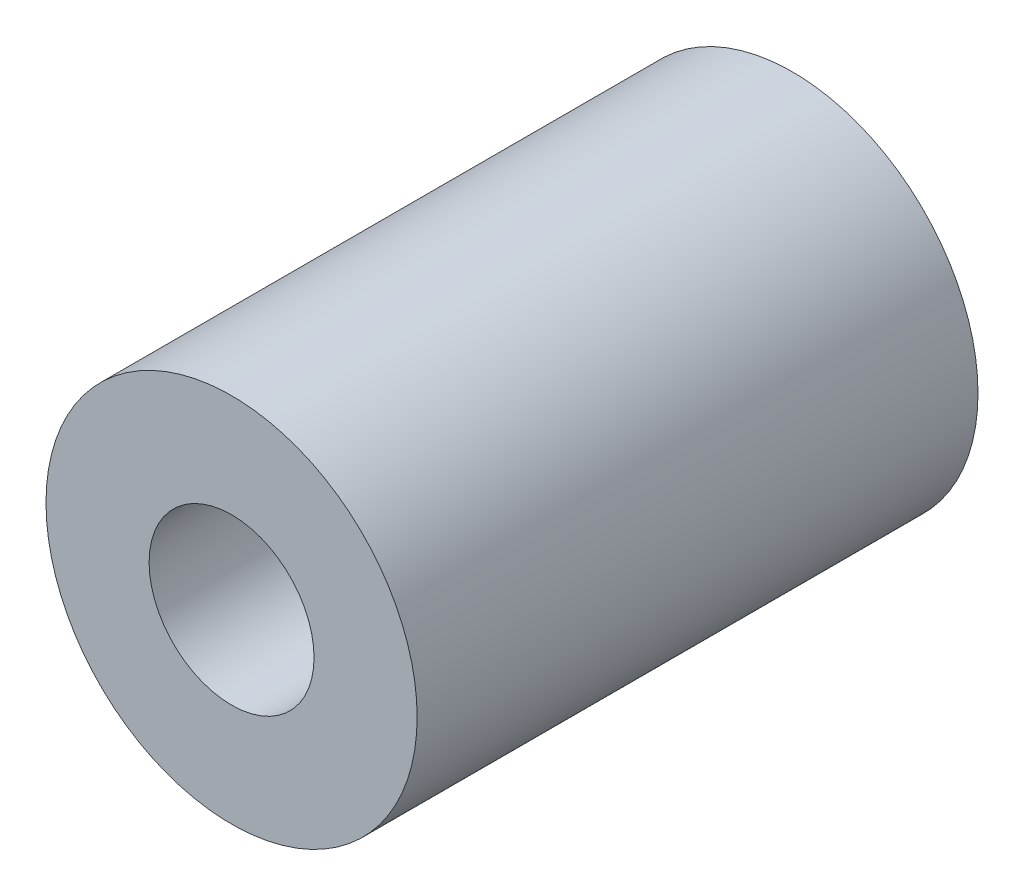
ISO-10303-21;
HEADER;
FILE_DESCRIPTION(('STEP AP214'),'2;1');
FILE_NAME('part.step','',(''),(''),'','','');
FILE_SCHEMA(('AUTOMOTIVE_DESIGN { 1 0 10303 214 1 1 1 1 }'));
ENDSEC;
DATA;
#1=APPLICATION_CONTEXT('core data for automotive mechanical design processes');
#2=APPLICATION_PROTOCOL_DEFINITION('international standard','automotive_design',2000,#1);
#3=PRODUCT_CONTEXT('',#1,'mechanical');
#4=PRODUCT('Part','Part','',(#3));
#5=PRODUCT_RELATED_PRODUCT_CATEGORY('part','',(#4));
#6=PRODUCT_DEFINITION_FORMATION('','',#4);
#7=PRODUCT_DEFINITION_CONTEXT('part definition',#1,'design');
#8=PRODUCT_DEFINITION('design','',#6,#7);
#9=PRODUCT_DEFINITION_SHAPE('','',#8);
#10=(LENGTH_UNIT() NAMED_UNIT(*) SI_UNIT(.MILLI.,.METRE.));
#11=(NAMED_UNIT(*) PLANE_ANGLE_UNIT() SI_UNIT($,.RADIAN.));
#12=(NAMED_UNIT(*) SI_UNIT($,.STERADIAN.) SOLID_ANGLE_UNIT());
#13=UNCERTAINTY_MEASURE_WITH_UNIT(LENGTH_MEASURE(1.E-05),#10,'distance_accuracy_value','');
#14=(GEOMETRIC_REPRESENTATION_CONTEXT(3) GLOBAL_UNCERTAINTY_ASSIGNED_CONTEXT((#13)) GLOBAL_UNIT_ASSIGNED_CONTEXT((#10,
#11,#12)) REPRESENTATION_CONTEXT('',''));
#15=CARTESIAN_POINT('',(0.,0.,0.));
#16=DIRECTION('',(0.,0.,1.));
#17=DIRECTION('',(1.,0.,0.));
#18=AXIS2_PLACEMENT_3D('',#15,#16,#17);
#19=CARTESIAN_POINT('',(0.,0.,6.8));
#20=DIRECTION('',(0.,0.,1.));
#21=DIRECTION('',(1.,0.,0.));
#22=AXIS2_PLACEMENT_3D('',#19,#20,#21);
#23=PLANE('',#22);
#24=CARTESIAN_POINT('',(0.,0.,6.8));
#25=DIRECTION('',(0.,0.,1.));
#26=DIRECTION('',(1.,0.,0.));
#27=AXIS2_PLACEMENT_3D('',#24,#25,#26);
#28=CIRCLE('',#27,2.25);
#29=CARTESIAN_POINT('',(2.25,0.,6.8));
#30=VERTEX_POINT('',#29);
#31=EDGE_CURVE('E10',#30,#30,#28,.T.);
#32=ORIENTED_EDGE('',*,*,#31,.T.);
#33=EDGE_LOOP('',(#32));
#34=FACE_BOUND('',#33,.T.);
#35=CARTESIAN_POINT('',(0.,0.,6.8));
#36=DIRECTION('',(0.,0.,1.));
#37=DIRECTION('',(1.,0.,0.));
#38=AXIS2_PLACEMENT_3D('',#35,#36,#37);
#39=CIRCLE('',#38,1.);
#40=CARTESIAN_POINT('',(1.,0.,6.8));
#41=VERTEX_POINT('',#40);
#42=EDGE_CURVE('E43',#41,#41,#39,.T.);
#43=ORIENTED_EDGE('',*,*,#42,.F.);
#44=EDGE_LOOP('',(#43));
#45=FACE_BOUND('',#44,.T.);
#46=ADVANCED_FACE('F32',(#34,#45),#23,.T.);
#47=CARTESIAN_POINT('',(0.,0.,0.));
#48=DIRECTION('',(0.,0.,1.));
#49=DIRECTION('',(1.,0.,0.));
#50=AXIS2_PLACEMENT_3D('',#47,#48,#49);
#51=PLANE('',#50);
#52=CARTESIAN_POINT('',(0.,0.,0.));
#53=DIRECTION('',(0.,0.,1.));
#54=DIRECTION('',(1.,0.,0.));
#55=AXIS2_PLACEMENT_3D('',#52,#53,#54);
#56=CIRCLE('',#55,2.25);
#57=CARTESIAN_POINT('',(2.25,0.,0.));
#58=VERTEX_POINT('',#57);
#59=EDGE_CURVE('E36',#58,#58,#56,.T.);
#60=ORIENTED_EDGE('',*,*,#59,.F.);
#61=EDGE_LOOP('',(#60));
#62=FACE_BOUND('',#61,.T.);
#63=CARTESIAN_POINT('',(0.,0.,0.));
#64=DIRECTION('',(0.,0.,1.));
#65=DIRECTION('',(1.,0.,0.));
#66=AXIS2_PLACEMENT_3D('',#63,#64,#65);
#67=CIRCLE('',#66,1.);
#68=CARTESIAN_POINT('',(1.,0.,0.));
#69=VERTEX_POINT('',#68);
#70=EDGE_CURVE('E45',#69,#69,#67,.T.);
#71=ORIENTED_EDGE('',*,*,#70,.T.);
#72=EDGE_LOOP('',(#71));
#73=FACE_BOUND('',#72,.T.);
#74=ADVANCED_FACE('F55',(#62,#73),#51,.F.);
#75=CARTESIAN_POINT('',(0.,0.,6.8));
#76=DIRECTION('',(0.,0.,-1.));
#77=DIRECTION('',(-1.,0.,0.));
#78=AXIS2_PLACEMENT_3D('',#75,#76,#77);
#79=CYLINDRICAL_SURFACE('',#78,2.25);
#80=ORIENTED_EDGE('',*,*,#31,.F.);
#81=EDGE_LOOP('',(#80));
#82=FACE_BOUND('',#81,.T.);
#83=ORIENTED_EDGE('',*,*,#59,.T.);
#84=EDGE_LOOP('',(#83));
#85=FACE_BOUND('',#84,.T.);
#86=ADVANCED_FACE('F34',(#82,#85),#79,.T.);
#87=CARTESIAN_POINT('',(0.,0.,6.8));
#88=DIRECTION('',(0.,0.,-1.));
#89=DIRECTION('',(-1.,0.,0.));
#90=AXIS2_PLACEMENT_3D('',#87,#88,#89);
#91=CYLINDRICAL_SURFACE('',#90,1.);
#92=ORIENTED_EDGE('',*,*,#42,.T.);
#93=EDGE_LOOP('',(#92));
#94=FACE_BOUND('',#93,.T.);
#95=ORIENTED_EDGE('',*,*,#70,.F.);
#96=EDGE_LOOP('',(#95));
#97=FACE_BOUND('',#96,.T.);
#98=ADVANCED_FACE('F51',(#94,#97),#91,.F.);
#99=CLOSED_SHELL('',(#46,#74,#86,#98));
#100=MANIFOLD_SOLID_BREP('B2',#99);
#101=ADVANCED_BREP_SHAPE_REPRESENTATION('',(#18,#100),#14);
#102=SHAPE_DEFINITION_REPRESENTATION(#9,#101);
ENDSEC;
END-ISO-10303-21;
